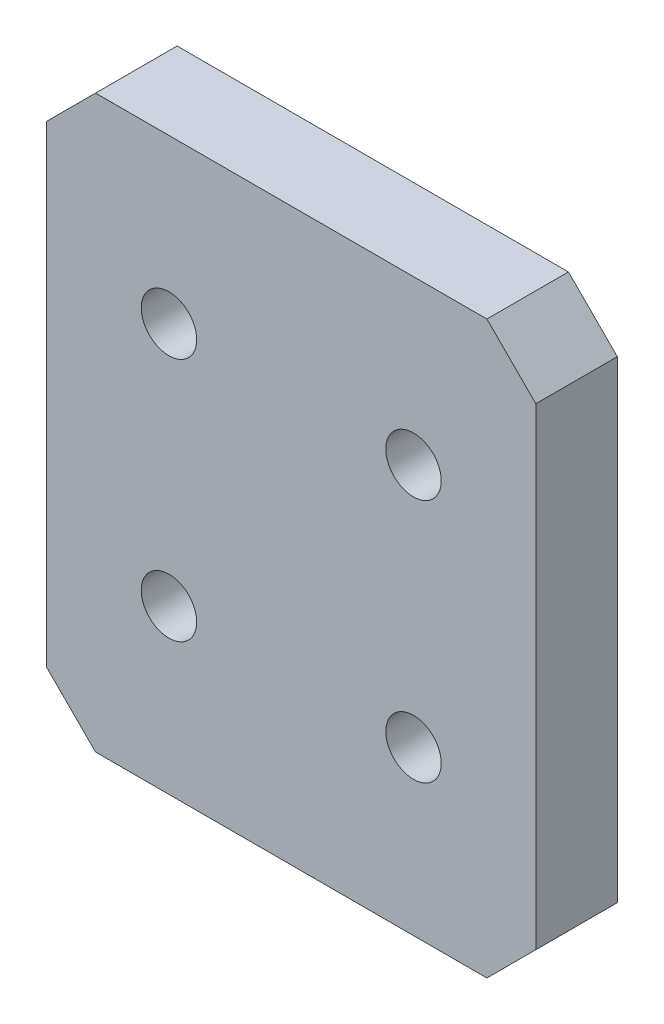
ISO-10303-21;
HEADER;
FILE_DESCRIPTION(('STEP AP214'),'2;1');
FILE_NAME('part.step','',(''),(''),'','','');
FILE_SCHEMA(('AUTOMOTIVE_DESIGN { 1 0 10303 214 1 1 1 1 }'));
ENDSEC;
DATA;
#1=APPLICATION_CONTEXT('core data for automotive mechanical design processes');
#2=APPLICATION_PROTOCOL_DEFINITION('international standard','automotive_design',2000,#1);
#3=PRODUCT_CONTEXT('',#1,'mechanical');
#4=PRODUCT('Part','Part','',(#3));
#5=PRODUCT_RELATED_PRODUCT_CATEGORY('part','',(#4));
#6=PRODUCT_DEFINITION_FORMATION('','',#4);
#7=PRODUCT_DEFINITION_CONTEXT('part definition',#1,'design');
#8=PRODUCT_DEFINITION('design','',#6,#7);
#9=PRODUCT_DEFINITION_SHAPE('','',#8);
#10=(LENGTH_UNIT() NAMED_UNIT(*) SI_UNIT(.MILLI.,.METRE.));
#11=(NAMED_UNIT(*) PLANE_ANGLE_UNIT() SI_UNIT($,.RADIAN.));
#12=(NAMED_UNIT(*) SI_UNIT($,.STERADIAN.) SOLID_ANGLE_UNIT());
#13=UNCERTAINTY_MEASURE_WITH_UNIT(LENGTH_MEASURE(1.E-05),#10,'distance_accuracy_value','');
#14=(GEOMETRIC_REPRESENTATION_CONTEXT(3) GLOBAL_UNCERTAINTY_ASSIGNED_CONTEXT((#13)) GLOBAL_UNIT_ASSIGNED_CONTEXT((#10,
#11,#12)) REPRESENTATION_CONTEXT('',''));
#15=CARTESIAN_POINT('',(0.,0.,0.));
#16=DIRECTION('',(0.,0.,1.));
#17=DIRECTION('',(1.,0.,0.));
#18=AXIS2_PLACEMENT_3D('',#15,#16,#17);
#19=CARTESIAN_POINT('',(15.,17.5,5.));
#20=DIRECTION('',(-1.,0.,0.));
#21=DIRECTION('',(0.,0.,1.));
#22=AXIS2_PLACEMENT_3D('',#19,#20,#21);
#23=PLANE('',#22);
#24=DIRECTION('',(0.,1.,0.));
#25=VECTOR('',#24,1.);
#26=CARTESIAN_POINT('',(15.,17.5,0.));
#27=LINE('',#26,#25);
#28=CARTESIAN_POINT('',(15.,-14.5,0.));
#29=VERTEX_POINT('',#28);
#30=CARTESIAN_POINT('',(15.,14.5,0.));
#31=VERTEX_POINT('',#30);
#32=EDGE_CURVE('E131',#29,#31,#27,.T.);
#33=ORIENTED_EDGE('',*,*,#32,.T.);
#34=DIRECTION('',(0.,0.,1.));
#35=VECTOR('',#34,1.);
#36=CARTESIAN_POINT('',(15.,14.5,5.));
#37=LINE('',#36,#35);
#38=CARTESIAN_POINT('',(15.,14.5,5.));
#39=VERTEX_POINT('',#38);
#40=EDGE_CURVE('E109',#31,#39,#37,.T.);
#41=ORIENTED_EDGE('',*,*,#40,.T.);
#42=DIRECTION('',(0.,1.,0.));
#43=VECTOR('',#42,1.);
#44=CARTESIAN_POINT('',(15.,17.5,5.));
#45=LINE('',#44,#43);
#46=CARTESIAN_POINT('',(15.,-14.5,5.));
#47=VERTEX_POINT('',#46);
#48=EDGE_CURVE('E141',#47,#39,#45,.T.);
#49=ORIENTED_EDGE('',*,*,#48,.F.);
#50=DIRECTION('',(0.,0.,-1.));
#51=VECTOR('',#50,1.);
#52=CARTESIAN_POINT('',(15.,-14.5,5.));
#53=LINE('',#52,#51);
#54=EDGE_CURVE('E114',#47,#29,#53,.T.);
#55=ORIENTED_EDGE('',*,*,#54,.T.);
#56=EDGE_LOOP('',(#33,#41,#49,#55));
#57=FACE_BOUND('',#56,.T.);
#58=ADVANCED_FACE('F37',(#57),#23,.F.);
#59=CARTESIAN_POINT('',(-15.,17.5,5.));
#60=DIRECTION('',(0.,-1.,0.));
#61=DIRECTION('',(0.,0.,-1.));
#62=AXIS2_PLACEMENT_3D('',#59,#60,#61);
#63=PLANE('',#62);
#64=DIRECTION('',(-1.,0.,0.));
#65=VECTOR('',#64,1.);
#66=CARTESIAN_POINT('',(-15.,17.5,5.));
#67=LINE('',#66,#65);
#68=CARTESIAN_POINT('',(12.,17.5,5.));
#69=VERTEX_POINT('',#68);
#70=CARTESIAN_POINT('',(-12.,17.5,5.));
#71=VERTEX_POINT('',#70);
#72=EDGE_CURVE('E124',#69,#71,#67,.T.);
#73=ORIENTED_EDGE('',*,*,#72,.F.);
#74=DIRECTION('',(0.,0.,-1.));
#75=VECTOR('',#74,1.);
#76=CARTESIAN_POINT('',(12.,17.5,5.));
#77=LINE('',#76,#75);
#78=CARTESIAN_POINT('',(12.,17.5,0.));
#79=VERTEX_POINT('',#78);
#80=EDGE_CURVE('E108',#69,#79,#77,.T.);
#81=ORIENTED_EDGE('',*,*,#80,.T.);
#82=DIRECTION('',(-1.,0.,0.));
#83=VECTOR('',#82,1.);
#84=CARTESIAN_POINT('',(-15.,17.5,0.));
#85=LINE('',#84,#83);
#86=CARTESIAN_POINT('',(-12.,17.5,0.));
#87=VERTEX_POINT('',#86);
#88=EDGE_CURVE('E121',#79,#87,#85,.T.);
#89=ORIENTED_EDGE('',*,*,#88,.T.);
#90=DIRECTION('',(0.,0.,1.));
#91=VECTOR('',#90,1.);
#92=CARTESIAN_POINT('',(-12.,17.5,5.));
#93=LINE('',#92,#91);
#94=EDGE_CURVE('E126',#87,#71,#93,.T.);
#95=ORIENTED_EDGE('',*,*,#94,.T.);
#96=EDGE_LOOP('',(#73,#81,#89,#95));
#97=FACE_BOUND('',#96,.T.);
#98=ADVANCED_FACE('F120',(#97),#63,.F.);
#99=CARTESIAN_POINT('',(-15.,17.5,5.));
#100=DIRECTION('',(1.,0.,0.));
#101=DIRECTION('',(0.,0.,-1.));
#102=AXIS2_PLACEMENT_3D('',#99,#100,#101);
#103=PLANE('',#102);
#104=DIRECTION('',(0.,-1.,0.));
#105=VECTOR('',#104,1.);
#106=CARTESIAN_POINT('',(-15.,17.5,0.));
#107=LINE('',#106,#105);
#108=CARTESIAN_POINT('',(-15.,14.5,0.));
#109=VERTEX_POINT('',#108);
#110=CARTESIAN_POINT('',(-15.,-14.5,0.));
#111=VERTEX_POINT('',#110);
#112=EDGE_CURVE('E130',#109,#111,#107,.T.);
#113=ORIENTED_EDGE('',*,*,#112,.T.);
#114=DIRECTION('',(0.,0.,1.));
#115=VECTOR('',#114,1.);
#116=CARTESIAN_POINT('',(-15.,-14.5,5.));
#117=LINE('',#116,#115);
#118=CARTESIAN_POINT('',(-15.,-14.5,5.));
#119=VERTEX_POINT('',#118);
#120=EDGE_CURVE('E11',#111,#119,#117,.T.);
#121=ORIENTED_EDGE('',*,*,#120,.T.);
#122=DIRECTION('',(0.,-1.,0.));
#123=VECTOR('',#122,1.);
#124=CARTESIAN_POINT('',(-15.,17.5,5.));
#125=LINE('',#124,#123);
#126=CARTESIAN_POINT('',(-15.,14.5,5.));
#127=VERTEX_POINT('',#126);
#128=EDGE_CURVE('E167',#127,#119,#125,.T.);
#129=ORIENTED_EDGE('',*,*,#128,.F.);
#130=DIRECTION('',(0.,0.,-1.));
#131=VECTOR('',#130,1.);
#132=CARTESIAN_POINT('',(-15.,14.5,5.));
#133=LINE('',#132,#131);
#134=EDGE_CURVE('E46',#127,#109,#133,.T.);
#135=ORIENTED_EDGE('',*,*,#134,.T.);
#136=EDGE_LOOP('',(#113,#121,#129,#135));
#137=FACE_BOUND('',#136,.T.);
#138=ADVANCED_FACE('F165',(#137),#103,.F.);
#139=CARTESIAN_POINT('',(-15.,-17.5,5.));
#140=DIRECTION('',(0.,1.,0.));
#141=DIRECTION('',(0.,0.,1.));
#142=AXIS2_PLACEMENT_3D('',#139,#140,#141);
#143=PLANE('',#142);
#144=DIRECTION('',(1.,0.,0.));
#145=VECTOR('',#144,1.);
#146=CARTESIAN_POINT('',(-15.,-17.5,0.));
#147=LINE('',#146,#145);
#148=CARTESIAN_POINT('',(-12.,-17.5,0.));
#149=VERTEX_POINT('',#148);
#150=CARTESIAN_POINT('',(12.,-17.5,0.));
#151=VERTEX_POINT('',#150);
#152=EDGE_CURVE('E134',#149,#151,#147,.T.);
#153=ORIENTED_EDGE('',*,*,#152,.T.);
#154=DIRECTION('',(0.,0.,1.));
#155=VECTOR('',#154,1.);
#156=CARTESIAN_POINT('',(12.,-17.5,5.));
#157=LINE('',#156,#155);
#158=CARTESIAN_POINT('',(12.,-17.5,5.));
#159=VERTEX_POINT('',#158);
#160=EDGE_CURVE('E53',#151,#159,#157,.T.);
#161=ORIENTED_EDGE('',*,*,#160,.T.);
#162=DIRECTION('',(1.,0.,0.));
#163=VECTOR('',#162,1.);
#164=CARTESIAN_POINT('',(-15.,-17.5,5.));
#165=LINE('',#164,#163);
#166=CARTESIAN_POINT('',(-12.,-17.5,5.));
#167=VERTEX_POINT('',#166);
#168=EDGE_CURVE('E142',#167,#159,#165,.T.);
#169=ORIENTED_EDGE('',*,*,#168,.F.);
#170=DIRECTION('',(0.,0.,-1.));
#171=VECTOR('',#170,1.);
#172=CARTESIAN_POINT('',(-12.,-17.5,5.));
#173=LINE('',#172,#171);
#174=EDGE_CURVE('E158',#167,#149,#173,.T.);
#175=ORIENTED_EDGE('',*,*,#174,.T.);
#176=EDGE_LOOP('',(#153,#161,#169,#175));
#177=FACE_BOUND('',#176,.T.);
#178=ADVANCED_FACE('F174',(#177),#143,.F.);
#179=CARTESIAN_POINT('',(0.,0.,5.));
#180=DIRECTION('',(0.,0.,1.));
#181=DIRECTION('',(1.,0.,0.));
#182=AXIS2_PLACEMENT_3D('',#179,#180,#181);
#183=PLANE('',#182);
#184=CARTESIAN_POINT('',(7.5,-7.5,5.));
#185=DIRECTION('',(0.,0.,1.));
#186=DIRECTION('',(1.,0.,0.));
#187=AXIS2_PLACEMENT_3D('',#184,#185,#186);
#188=CIRCLE('',#187,1.7);
#189=CARTESIAN_POINT('',(9.2,-7.5,5.));
#190=VERTEX_POINT('',#189);
#191=EDGE_CURVE('E201',#190,#190,#188,.T.);
#192=ORIENTED_EDGE('',*,*,#191,.F.);
#193=EDGE_LOOP('',(#192));
#194=FACE_BOUND('',#193,.T.);
#195=CARTESIAN_POINT('',(-7.5,7.5,5.));
#196=DIRECTION('',(0.,0.,1.));
#197=DIRECTION('',(1.,0.,0.));
#198=AXIS2_PLACEMENT_3D('',#195,#196,#197);
#199=CIRCLE('',#198,1.7);
#200=CARTESIAN_POINT('',(-5.8,7.5,5.));
#201=VERTEX_POINT('',#200);
#202=EDGE_CURVE('E195',#201,#201,#199,.T.);
#203=ORIENTED_EDGE('',*,*,#202,.F.);
#204=EDGE_LOOP('',(#203));
#205=FACE_BOUND('',#204,.T.);
#206=CARTESIAN_POINT('',(-7.5,-7.5,5.));
#207=DIRECTION('',(0.,0.,1.));
#208=DIRECTION('',(1.,0.,0.));
#209=AXIS2_PLACEMENT_3D('',#206,#207,#208);
#210=CIRCLE('',#209,1.7);
#211=CARTESIAN_POINT('',(-5.8,-7.5,5.));
#212=VERTEX_POINT('',#211);
#213=EDGE_CURVE('E189',#212,#212,#210,.T.);
#214=ORIENTED_EDGE('',*,*,#213,.F.);
#215=EDGE_LOOP('',(#214));
#216=FACE_BOUND('',#215,.T.);
#217=CARTESIAN_POINT('',(7.5,7.5,5.));
#218=DIRECTION('',(0.,0.,1.));
#219=DIRECTION('',(1.,0.,0.));
#220=AXIS2_PLACEMENT_3D('',#217,#218,#219);
#221=CIRCLE('',#220,1.7);
#222=CARTESIAN_POINT('',(9.2,7.5,5.));
#223=VERTEX_POINT('',#222);
#224=EDGE_CURVE('E183',#223,#223,#221,.T.);
#225=ORIENTED_EDGE('',*,*,#224,.F.);
#226=EDGE_LOOP('',(#225));
#227=FACE_BOUND('',#226,.T.);
#228=ORIENTED_EDGE('',*,*,#48,.T.);
#229=DIRECTION('',(0.707106781186546,-0.707106781186549,0.));
#230=VECTOR('',#229,1.);
#231=CARTESIAN_POINT('',(14.75,14.75,5.));
#232=LINE('',#231,#230);
#233=EDGE_CURVE('E156',#39,#69,#232,.F.);
#234=ORIENTED_EDGE('',*,*,#233,.T.);
#235=ORIENTED_EDGE('',*,*,#72,.T.);
#236=DIRECTION('',(0.707106781186549,0.707106781186546,0.));
#237=VECTOR('',#236,1.);
#238=CARTESIAN_POINT('',(-14.75,14.75,5.));
#239=LINE('',#238,#237);
#240=EDGE_CURVE('E151',#71,#127,#239,.F.);
#241=ORIENTED_EDGE('',*,*,#240,.T.);
#242=ORIENTED_EDGE('',*,*,#128,.T.);
#243=DIRECTION('',(-0.707106781186546,0.707106781186549,0.));
#244=VECTOR('',#243,1.);
#245=CARTESIAN_POINT('',(-14.75,-14.75,5.));
#246=LINE('',#245,#244);
#247=EDGE_CURVE('E60',#119,#167,#246,.F.);
#248=ORIENTED_EDGE('',*,*,#247,.T.);
#249=ORIENTED_EDGE('',*,*,#168,.T.);
#250=DIRECTION('',(-0.707106781186549,-0.707106781186546,0.));
#251=VECTOR('',#250,1.);
#252=CARTESIAN_POINT('',(14.75,-14.75,5.));
#253=LINE('',#252,#251);
#254=EDGE_CURVE('E154',#159,#47,#253,.F.);
#255=ORIENTED_EDGE('',*,*,#254,.T.);
#256=EDGE_LOOP('',(#228,#234,#235,#241,#242,#248,#249,#255));
#257=FACE_BOUND('',#256,.T.);
#258=ADVANCED_FACE('F207',(#194,#205,#216,#227,#257),#183,.T.);
#259=CARTESIAN_POINT('',(0.,0.,0.));
#260=DIRECTION('',(0.,0.,1.));
#261=DIRECTION('',(1.,0.,0.));
#262=AXIS2_PLACEMENT_3D('',#259,#260,#261);
#263=PLANE('',#262);
#264=CARTESIAN_POINT('',(7.5,-7.5,0.));
#265=DIRECTION('',(0.,0.,1.));
#266=DIRECTION('',(1.,0.,0.));
#267=AXIS2_PLACEMENT_3D('',#264,#265,#266);
#268=CIRCLE('',#267,1.7);
#269=CARTESIAN_POINT('',(9.2,-7.5,0.));
#270=VERTEX_POINT('',#269);
#271=EDGE_CURVE('E198',#270,#270,#268,.T.);
#272=ORIENTED_EDGE('',*,*,#271,.T.);
#273=EDGE_LOOP('',(#272));
#274=FACE_BOUND('',#273,.T.);
#275=CARTESIAN_POINT('',(-7.5,7.5,0.));
#276=DIRECTION('',(0.,0.,1.));
#277=DIRECTION('',(1.,0.,0.));
#278=AXIS2_PLACEMENT_3D('',#275,#276,#277);
#279=CIRCLE('',#278,1.7);
#280=CARTESIAN_POINT('',(-5.8,7.5,0.));
#281=VERTEX_POINT('',#280);
#282=EDGE_CURVE('E192',#281,#281,#279,.T.);
#283=ORIENTED_EDGE('',*,*,#282,.T.);
#284=EDGE_LOOP('',(#283));
#285=FACE_BOUND('',#284,.T.);
#286=CARTESIAN_POINT('',(-7.5,-7.5,0.));
#287=DIRECTION('',(0.,0.,1.));
#288=DIRECTION('',(1.,0.,0.));
#289=AXIS2_PLACEMENT_3D('',#286,#287,#288);
#290=CIRCLE('',#289,1.7);
#291=CARTESIAN_POINT('',(-5.8,-7.5,0.));
#292=VERTEX_POINT('',#291);
#293=EDGE_CURVE('E186',#292,#292,#290,.T.);
#294=ORIENTED_EDGE('',*,*,#293,.T.);
#295=EDGE_LOOP('',(#294));
#296=FACE_BOUND('',#295,.T.);
#297=CARTESIAN_POINT('',(7.5,7.5,0.));
#298=DIRECTION('',(0.,0.,1.));
#299=DIRECTION('',(1.,0.,0.));
#300=AXIS2_PLACEMENT_3D('',#297,#298,#299);
#301=CIRCLE('',#300,1.7);
#302=CARTESIAN_POINT('',(9.2,7.5,0.));
#303=VERTEX_POINT('',#302);
#304=EDGE_CURVE('E136',#303,#303,#301,.T.);
#305=ORIENTED_EDGE('',*,*,#304,.T.);
#306=EDGE_LOOP('',(#305));
#307=FACE_BOUND('',#306,.T.);
#308=ORIENTED_EDGE('',*,*,#88,.F.);
#309=DIRECTION('',(-0.707106781186546,0.707106781186549,0.));
#310=VECTOR('',#309,1.);
#311=CARTESIAN_POINT('',(12.,17.5,0.));
#312=LINE('',#311,#310);
#313=EDGE_CURVE('E104',#79,#31,#312,.F.);
#314=ORIENTED_EDGE('',*,*,#313,.T.);
#315=ORIENTED_EDGE('',*,*,#32,.F.);
#316=DIRECTION('',(0.707106781186549,0.707106781186546,0.));
#317=VECTOR('',#316,1.);
#318=CARTESIAN_POINT('',(15.,-14.5,0.));
#319=LINE('',#318,#317);
#320=EDGE_CURVE('E115',#29,#151,#319,.F.);
#321=ORIENTED_EDGE('',*,*,#320,.T.);
#322=ORIENTED_EDGE('',*,*,#152,.F.);
#323=DIRECTION('',(0.707106781186546,-0.707106781186549,0.));
#324=VECTOR('',#323,1.);
#325=CARTESIAN_POINT('',(-12.,-17.5,0.));
#326=LINE('',#325,#324);
#327=EDGE_CURVE('E145',#149,#111,#326,.F.);
#328=ORIENTED_EDGE('',*,*,#327,.T.);
#329=ORIENTED_EDGE('',*,*,#112,.F.);
#330=DIRECTION('',(-0.707106781186549,-0.707106781186546,0.));
#331=VECTOR('',#330,1.);
#332=CARTESIAN_POINT('',(-15.,14.5,0.));
#333=LINE('',#332,#331);
#334=EDGE_CURVE('E125',#109,#87,#333,.F.);
#335=ORIENTED_EDGE('',*,*,#334,.T.);
#336=EDGE_LOOP('',(#308,#314,#315,#321,#322,#328,#329,#335));
#337=FACE_BOUND('',#336,.T.);
#338=ADVANCED_FACE('F128',(#274,#285,#296,#307,#337),#263,.F.);
#339=CARTESIAN_POINT('',(7.5,7.5,5.));
#340=DIRECTION('',(0.,0.,1.));
#341=DIRECTION('',(1.,0.,0.));
#342=AXIS2_PLACEMENT_3D('',#339,#340,#341);
#343=CYLINDRICAL_SURFACE('',#342,1.7);
#344=ORIENTED_EDGE('',*,*,#304,.F.);
#345=EDGE_LOOP('',(#344));
#346=FACE_BOUND('',#345,.T.);
#347=ORIENTED_EDGE('',*,*,#224,.T.);
#348=EDGE_LOOP('',(#347));
#349=FACE_BOUND('',#348,.T.);
#350=ADVANCED_FACE('F251',(#346,#349),#343,.F.);
#351=CARTESIAN_POINT('',(-7.5,-7.5,5.));
#352=DIRECTION('',(0.,0.,1.));
#353=DIRECTION('',(1.,0.,0.));
#354=AXIS2_PLACEMENT_3D('',#351,#352,#353);
#355=CYLINDRICAL_SURFACE('',#354,1.7);
#356=ORIENTED_EDGE('',*,*,#293,.F.);
#357=EDGE_LOOP('',(#356));
#358=FACE_BOUND('',#357,.T.);
#359=ORIENTED_EDGE('',*,*,#213,.T.);
#360=EDGE_LOOP('',(#359));
#361=FACE_BOUND('',#360,.T.);
#362=ADVANCED_FACE('F256',(#358,#361),#355,.F.);
#363=CARTESIAN_POINT('',(-7.5,7.5,5.));
#364=DIRECTION('',(0.,0.,1.));
#365=DIRECTION('',(1.,0.,0.));
#366=AXIS2_PLACEMENT_3D('',#363,#364,#365);
#367=CYLINDRICAL_SURFACE('',#366,1.7);
#368=ORIENTED_EDGE('',*,*,#282,.F.);
#369=EDGE_LOOP('',(#368));
#370=FACE_BOUND('',#369,.T.);
#371=ORIENTED_EDGE('',*,*,#202,.T.);
#372=EDGE_LOOP('',(#371));
#373=FACE_BOUND('',#372,.T.);
#374=ADVANCED_FACE('F260',(#370,#373),#367,.F.);
#375=CARTESIAN_POINT('',(7.5,-7.5,5.));
#376=DIRECTION('',(0.,0.,1.));
#377=DIRECTION('',(1.,0.,0.));
#378=AXIS2_PLACEMENT_3D('',#375,#376,#377);
#379=CYLINDRICAL_SURFACE('',#378,1.7);
#380=ORIENTED_EDGE('',*,*,#271,.F.);
#381=EDGE_LOOP('',(#380));
#382=FACE_BOUND('',#381,.T.);
#383=ORIENTED_EDGE('',*,*,#191,.T.);
#384=EDGE_LOOP('',(#383));
#385=FACE_BOUND('',#384,.T.);
#386=ADVANCED_FACE('F205',(#382,#385),#379,.F.);
#387=CARTESIAN_POINT('',(12.,17.5,5.));
#388=DIRECTION('',(-0.707106781186549,-0.707106781186546,0.));
#389=DIRECTION('',(0.,0.,-1.));
#390=AXIS2_PLACEMENT_3D('',#387,#388,#389);
#391=PLANE('',#390);
#392=ORIENTED_EDGE('',*,*,#233,.F.);
#393=ORIENTED_EDGE('',*,*,#40,.F.);
#394=ORIENTED_EDGE('',*,*,#313,.F.);
#395=ORIENTED_EDGE('',*,*,#80,.F.);
#396=EDGE_LOOP('',(#392,#393,#394,#395));
#397=FACE_BOUND('',#396,.T.);
#398=ADVANCED_FACE('F107',(#397),#391,.F.);
#399=CARTESIAN_POINT('',(15.,-14.5,5.));
#400=DIRECTION('',(-0.707106781186546,0.707106781186549,0.));
#401=DIRECTION('',(0.,0.,-1.));
#402=AXIS2_PLACEMENT_3D('',#399,#400,#401);
#403=PLANE('',#402);
#404=ORIENTED_EDGE('',*,*,#254,.F.);
#405=ORIENTED_EDGE('',*,*,#160,.F.);
#406=ORIENTED_EDGE('',*,*,#320,.F.);
#407=ORIENTED_EDGE('',*,*,#54,.F.);
#408=EDGE_LOOP('',(#404,#405,#406,#407));
#409=FACE_BOUND('',#408,.T.);
#410=ADVANCED_FACE('F220',(#409),#403,.F.);
#411=CARTESIAN_POINT('',(-12.,-17.5,5.));
#412=DIRECTION('',(0.707106781186549,0.707106781186546,0.));
#413=DIRECTION('',(0.,0.,-1.));
#414=AXIS2_PLACEMENT_3D('',#411,#412,#413);
#415=PLANE('',#414);
#416=ORIENTED_EDGE('',*,*,#247,.F.);
#417=ORIENTED_EDGE('',*,*,#120,.F.);
#418=ORIENTED_EDGE('',*,*,#327,.F.);
#419=ORIENTED_EDGE('',*,*,#174,.F.);
#420=EDGE_LOOP('',(#416,#417,#418,#419));
#421=FACE_BOUND('',#420,.T.);
#422=ADVANCED_FACE('F173',(#421),#415,.F.);
#423=CARTESIAN_POINT('',(-15.,14.5,5.));
#424=DIRECTION('',(0.707106781186546,-0.707106781186549,0.));
#425=DIRECTION('',(0.,0.,-1.));
#426=AXIS2_PLACEMENT_3D('',#423,#424,#425);
#427=PLANE('',#426);
#428=ORIENTED_EDGE('',*,*,#240,.F.);
#429=ORIENTED_EDGE('',*,*,#94,.F.);
#430=ORIENTED_EDGE('',*,*,#334,.F.);
#431=ORIENTED_EDGE('',*,*,#134,.F.);
#432=EDGE_LOOP('',(#428,#429,#430,#431));
#433=FACE_BOUND('',#432,.T.);
#434=ADVANCED_FACE('F40',(#433),#427,.F.);
#435=CLOSED_SHELL('',(#58,#98,#138,#178,#258,#338,#350,#362,#374,#386,#398,#410,#422,#434));
#436=MANIFOLD_SOLID_BREP('B2',#435);
#437=ADVANCED_BREP_SHAPE_REPRESENTATION('',(#18,#436),#14);
#438=SHAPE_DEFINITION_REPRESENTATION(#9,#437);
ENDSEC;
END-ISO-10303-21;
